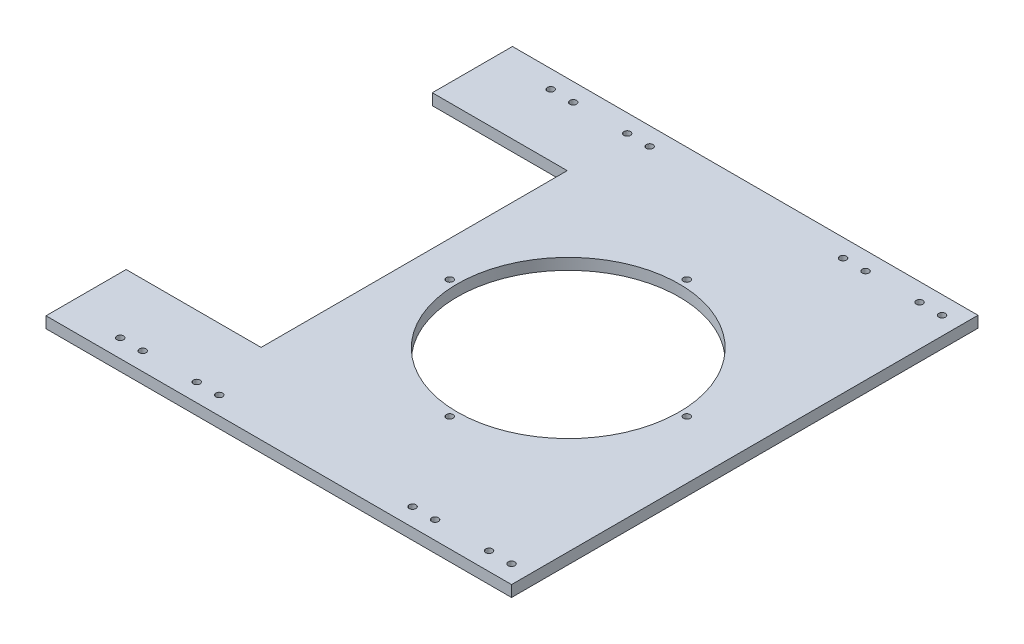
ISO-10303-21;
HEADER;
FILE_DESCRIPTION(('STEP AP214'),'2;1');
FILE_NAME('part.step','',(''),(''),'','','');
FILE_SCHEMA(('AUTOMOTIVE_DESIGN { 1 0 10303 214 1 1 1 1 }'));
ENDSEC;
DATA;
#1=APPLICATION_CONTEXT('core data for automotive mechanical design processes');
#2=APPLICATION_PROTOCOL_DEFINITION('international standard','automotive_design',2000,#1);
#3=PRODUCT_CONTEXT('',#1,'mechanical');
#4=PRODUCT('Part','Part','',(#3));
#5=PRODUCT_RELATED_PRODUCT_CATEGORY('part','',(#4));
#6=PRODUCT_DEFINITION_FORMATION('','',#4);
#7=PRODUCT_DEFINITION_CONTEXT('part definition',#1,'design');
#8=PRODUCT_DEFINITION('design','',#6,#7);
#9=PRODUCT_DEFINITION_SHAPE('','',#8);
#10=(LENGTH_UNIT() NAMED_UNIT(*) SI_UNIT(.MILLI.,.METRE.));
#11=(NAMED_UNIT(*) PLANE_ANGLE_UNIT() SI_UNIT($,.RADIAN.));
#12=(NAMED_UNIT(*) SI_UNIT($,.STERADIAN.) SOLID_ANGLE_UNIT());
#13=UNCERTAINTY_MEASURE_WITH_UNIT(LENGTH_MEASURE(1.E-05),#10,'distance_accuracy_value','');
#14=(GEOMETRIC_REPRESENTATION_CONTEXT(3) GLOBAL_UNCERTAINTY_ASSIGNED_CONTEXT((#13)) GLOBAL_UNIT_ASSIGNED_CONTEXT((#10,
#11,#12)) REPRESENTATION_CONTEXT('',''));
#15=CARTESIAN_POINT('',(0.,0.,0.));
#16=DIRECTION('',(0.,0.,1.));
#17=DIRECTION('',(1.,0.,0.));
#18=AXIS2_PLACEMENT_3D('',#15,#16,#17);
#19=CARTESIAN_POINT('',(-131.445,6.35,131.70027));
#20=DIRECTION('',(1.,0.,0.));
#21=DIRECTION('',(0.,0.,-1.));
#22=AXIS2_PLACEMENT_3D('',#19,#20,#21);
#23=PLANE('',#22);
#24=DIRECTION('',(0.,0.,1.));
#25=VECTOR('',#24,1.);
#26=CARTESIAN_POINT('',(-131.445,0.,131.70027));
#27=LINE('',#26,#25);
#28=CARTESIAN_POINT('',(-131.445,0.,-131.70027));
#29=VERTEX_POINT('',#28);
#30=CARTESIAN_POINT('',(-131.445,0.,-86.4439759484741));
#31=VERTEX_POINT('',#30);
#32=EDGE_CURVE('E137',#29,#31,#27,.T.);
#33=ORIENTED_EDGE('',*,*,#32,.T.);
#34=DIRECTION('',(0.,1.,0.));
#35=VECTOR('',#34,1.);
#36=CARTESIAN_POINT('',(-131.445,6.35,-86.4439759484741));
#37=LINE('',#36,#35);
#38=CARTESIAN_POINT('',(-131.445,6.35,-86.4439759484741));
#39=VERTEX_POINT('',#38);
#40=EDGE_CURVE('E41',#31,#39,#37,.T.);
#41=ORIENTED_EDGE('',*,*,#40,.T.);
#42=DIRECTION('',(0.,0.,1.));
#43=VECTOR('',#42,1.);
#44=CARTESIAN_POINT('',(-131.445,6.35,131.70027));
#45=LINE('',#44,#43);
#46=CARTESIAN_POINT('',(-131.445,6.35,-131.70027));
#47=VERTEX_POINT('',#46);
#48=EDGE_CURVE('E123',#47,#39,#45,.T.);
#49=ORIENTED_EDGE('',*,*,#48,.F.);
#50=DIRECTION('',(0.,-1.,0.));
#51=VECTOR('',#50,1.);
#52=CARTESIAN_POINT('',(-131.445,6.35,-131.70027));
#53=LINE('',#52,#51);
#54=EDGE_CURVE('E136',#47,#29,#53,.T.);
#55=ORIENTED_EDGE('',*,*,#54,.T.);
#56=EDGE_LOOP('',(#33,#41,#49,#55));
#57=FACE_BOUND('',#56,.T.);
#58=ADVANCED_FACE('F33',(#57),#23,.F.);
#59=CARTESIAN_POINT('',(0.,6.35,0.));
#60=DIRECTION('',(0.,1.,0.));
#61=DIRECTION('',(0.,0.,1.));
#62=AXIS2_PLACEMENT_3D('',#59,#60,#61);
#63=PLANE('',#62);
#64=DIRECTION('',(-1.,0.,0.));
#65=VECTOR('',#64,1.);
#66=CARTESIAN_POINT('',(-55.245,6.35,-86.4439759484741));
#67=LINE('',#66,#65);
#68=CARTESIAN_POINT('',(-55.245,6.35,-86.4439759484741));
#69=VERTEX_POINT('',#68);
#70=EDGE_CURVE('E156',#69,#39,#67,.T.);
#71=ORIENTED_EDGE('',*,*,#70,.F.);
#72=DIRECTION('',(0.,0.,-1.));
#73=VECTOR('',#72,1.);
#74=CARTESIAN_POINT('',(-55.245,6.35,86.4439759484741));
#75=LINE('',#74,#73);
#76=CARTESIAN_POINT('',(-55.245,6.35,86.4439759484741));
#77=VERTEX_POINT('',#76);
#78=EDGE_CURVE('E119',#77,#69,#75,.T.);
#79=ORIENTED_EDGE('',*,*,#78,.F.);
#80=DIRECTION('',(1.,0.,0.));
#81=VECTOR('',#80,1.);
#82=CARTESIAN_POINT('',(-55.245,6.35,86.4439759484741));
#83=LINE('',#82,#81);
#84=CARTESIAN_POINT('',(-131.445,6.35,86.4439759484741));
#85=VERTEX_POINT('',#84);
#86=EDGE_CURVE('E109',#85,#77,#83,.T.);
#87=ORIENTED_EDGE('',*,*,#86,.F.);
#88=CARTESIAN_POINT('',(-131.445,6.35,131.70027));
#89=VERTEX_POINT('',#88);
#90=EDGE_CURVE('E85',#85,#89,#45,.T.);
#91=ORIENTED_EDGE('',*,*,#90,.T.);
#92=DIRECTION('',(1.,0.,0.));
#93=VECTOR('',#92,1.);
#94=CARTESIAN_POINT('',(131.445,6.35,131.70027));
#95=LINE('',#94,#93);
#96=CARTESIAN_POINT('',(131.445,6.35,131.70027));
#97=VERTEX_POINT('',#96);
#98=EDGE_CURVE('E125',#89,#97,#95,.T.);
#99=ORIENTED_EDGE('',*,*,#98,.T.);
#100=DIRECTION('',(0.,0.,-1.));
#101=VECTOR('',#100,1.);
#102=CARTESIAN_POINT('',(131.445,6.35,131.70027));
#103=LINE('',#102,#101);
#104=CARTESIAN_POINT('',(131.445,6.35,-131.70027));
#105=VERTEX_POINT('',#104);
#106=EDGE_CURVE('E133',#97,#105,#103,.T.);
#107=ORIENTED_EDGE('',*,*,#106,.T.);
#108=DIRECTION('',(-1.,0.,0.));
#109=VECTOR('',#108,1.);
#110=CARTESIAN_POINT('',(131.445,6.35,-131.70027));
#111=LINE('',#110,#109);
#112=EDGE_CURVE('E57',#105,#47,#111,.T.);
#113=ORIENTED_EDGE('',*,*,#112,.T.);
#114=ORIENTED_EDGE('',*,*,#48,.T.);
#115=EDGE_LOOP('',(#71,#79,#87,#91,#99,#107,#113,#114));
#116=FACE_BOUND('',#115,.T.);
#117=CARTESIAN_POINT('',(-43.815,6.35,-121.54027));
#118=DIRECTION('',(0.,1.,0.));
#119=DIRECTION('',(0.,0.,1.));
#120=AXIS2_PLACEMENT_3D('',#117,#118,#119);
#121=CIRCLE('',#120,1.89864999999999);
#122=CARTESIAN_POINT('',(-43.815,6.35,-119.64162));
#123=VERTEX_POINT('',#122);
#124=EDGE_CURVE('E167',#123,#123,#121,.T.);
#125=ORIENTED_EDGE('',*,*,#124,.F.);
#126=EDGE_LOOP('',(#125));
#127=FACE_BOUND('',#126,.T.);
#128=CARTESIAN_POINT('',(-56.515,6.35,-121.54027));
#129=DIRECTION('',(0.,1.,0.));
#130=DIRECTION('',(0.,0.,1.));
#131=AXIS2_PLACEMENT_3D('',#128,#129,#130);
#132=CIRCLE('',#131,1.89864999999999);
#133=CARTESIAN_POINT('',(-56.515,6.35,-119.64162));
#134=VERTEX_POINT('',#133);
#135=EDGE_CURVE('E173',#134,#134,#132,.T.);
#136=ORIENTED_EDGE('',*,*,#135,.F.);
#137=EDGE_LOOP('',(#136));
#138=FACE_BOUND('',#137,.T.);
#139=CARTESIAN_POINT('',(-86.995,6.35,-121.54027));
#140=DIRECTION('',(0.,1.,0.));
#141=DIRECTION('',(0.,0.,1.));
#142=AXIS2_PLACEMENT_3D('',#139,#140,#141);
#143=CIRCLE('',#142,1.89864999999999);
#144=CARTESIAN_POINT('',(-86.995,6.35,-119.64162));
#145=VERTEX_POINT('',#144);
#146=EDGE_CURVE('E179',#145,#145,#143,.T.);
#147=ORIENTED_EDGE('',*,*,#146,.F.);
#148=EDGE_LOOP('',(#147));
#149=FACE_BOUND('',#148,.T.);
#150=CARTESIAN_POINT('',(-99.695,6.35,-121.54027));
#151=DIRECTION('',(0.,1.,0.));
#152=DIRECTION('',(0.,0.,1.));
#153=AXIS2_PLACEMENT_3D('',#150,#151,#152);
#154=CIRCLE('',#153,1.89864999999999);
#155=CARTESIAN_POINT('',(-99.695,6.35,-119.64162));
#156=VERTEX_POINT('',#155);
#157=EDGE_CURVE('E185',#156,#156,#154,.T.);
#158=ORIENTED_EDGE('',*,*,#157,.F.);
#159=EDGE_LOOP('',(#158));
#160=FACE_BOUND('',#159,.T.);
#161=CARTESIAN_POINT('',(-43.815,6.35,121.54027));
#162=DIRECTION('',(0.,1.,0.));
#163=DIRECTION('',(0.,0.,1.));
#164=AXIS2_PLACEMENT_3D('',#161,#162,#163);
#165=CIRCLE('',#164,1.89864999999999);
#166=CARTESIAN_POINT('',(-43.815,6.35,123.43892));
#167=VERTEX_POINT('',#166);
#168=EDGE_CURVE('E191',#167,#167,#165,.T.);
#169=ORIENTED_EDGE('',*,*,#168,.F.);
#170=EDGE_LOOP('',(#169));
#171=FACE_BOUND('',#170,.T.);
#172=CARTESIAN_POINT('',(-56.515,6.35,121.54027));
#173=DIRECTION('',(0.,1.,0.));
#174=DIRECTION('',(0.,0.,1.));
#175=AXIS2_PLACEMENT_3D('',#172,#173,#174);
#176=CIRCLE('',#175,1.89864999999999);
#177=CARTESIAN_POINT('',(-56.515,6.35,123.43892));
#178=VERTEX_POINT('',#177);
#179=EDGE_CURVE('E197',#178,#178,#176,.T.);
#180=ORIENTED_EDGE('',*,*,#179,.F.);
#181=EDGE_LOOP('',(#180));
#182=FACE_BOUND('',#181,.T.);
#183=CARTESIAN_POINT('',(-86.995,6.35,121.54027));
#184=DIRECTION('',(0.,1.,0.));
#185=DIRECTION('',(0.,0.,1.));
#186=AXIS2_PLACEMENT_3D('',#183,#184,#185);
#187=CIRCLE('',#186,1.89864999999999);
#188=CARTESIAN_POINT('',(-86.995,6.35,123.43892));
#189=VERTEX_POINT('',#188);
#190=EDGE_CURVE('E203',#189,#189,#187,.T.);
#191=ORIENTED_EDGE('',*,*,#190,.F.);
#192=EDGE_LOOP('',(#191));
#193=FACE_BOUND('',#192,.T.);
#194=CARTESIAN_POINT('',(-99.695,6.35,121.54027));
#195=DIRECTION('',(0.,1.,0.));
#196=DIRECTION('',(0.,0.,1.));
#197=AXIS2_PLACEMENT_3D('',#194,#195,#196);
#198=CIRCLE('',#197,1.89864999999999);
#199=CARTESIAN_POINT('',(-99.695,6.35,123.43892));
#200=VERTEX_POINT('',#199);
#201=EDGE_CURVE('E209',#200,#200,#198,.T.);
#202=ORIENTED_EDGE('',*,*,#201,.F.);
#203=EDGE_LOOP('',(#202));
#204=FACE_BOUND('',#203,.T.);
#205=CARTESIAN_POINT('',(121.285,6.35,-121.54027));
#206=DIRECTION('',(0.,1.,0.));
#207=DIRECTION('',(0.,0.,1.));
#208=AXIS2_PLACEMENT_3D('',#205,#206,#207);
#209=CIRCLE('',#208,1.89864999999999);
#210=CARTESIAN_POINT('',(121.285,6.35,-119.64162));
#211=VERTEX_POINT('',#210);
#212=EDGE_CURVE('E215',#211,#211,#209,.T.);
#213=ORIENTED_EDGE('',*,*,#212,.F.);
#214=EDGE_LOOP('',(#213));
#215=FACE_BOUND('',#214,.T.);
#216=CARTESIAN_POINT('',(108.585,6.35,-121.54027));
#217=DIRECTION('',(0.,1.,0.));
#218=DIRECTION('',(0.,0.,1.));
#219=AXIS2_PLACEMENT_3D('',#216,#217,#218);
#220=CIRCLE('',#219,1.89864999999999);
#221=CARTESIAN_POINT('',(108.585,6.35,-119.64162));
#222=VERTEX_POINT('',#221);
#223=EDGE_CURVE('E221',#222,#222,#220,.T.);
#224=ORIENTED_EDGE('',*,*,#223,.F.);
#225=EDGE_LOOP('',(#224));
#226=FACE_BOUND('',#225,.T.);
#227=CARTESIAN_POINT('',(78.105,6.35,-121.54027));
#228=DIRECTION('',(0.,1.,0.));
#229=DIRECTION('',(0.,0.,1.));
#230=AXIS2_PLACEMENT_3D('',#227,#228,#229);
#231=CIRCLE('',#230,1.89864999999999);
#232=CARTESIAN_POINT('',(78.105,6.35,-119.64162));
#233=VERTEX_POINT('',#232);
#234=EDGE_CURVE('E227',#233,#233,#231,.T.);
#235=ORIENTED_EDGE('',*,*,#234,.F.);
#236=EDGE_LOOP('',(#235));
#237=FACE_BOUND('',#236,.T.);
#238=CARTESIAN_POINT('',(65.405,6.35,-121.54027));
#239=DIRECTION('',(0.,1.,0.));
#240=DIRECTION('',(0.,0.,1.));
#241=AXIS2_PLACEMENT_3D('',#238,#239,#240);
#242=CIRCLE('',#241,1.89864999999999);
#243=CARTESIAN_POINT('',(65.405,6.35,-119.64162));
#244=VERTEX_POINT('',#243);
#245=EDGE_CURVE('E233',#244,#244,#242,.T.);
#246=ORIENTED_EDGE('',*,*,#245,.F.);
#247=EDGE_LOOP('',(#246));
#248=FACE_BOUND('',#247,.T.);
#249=CARTESIAN_POINT('',(121.285,6.35,121.54027));
#250=DIRECTION('',(0.,1.,0.));
#251=DIRECTION('',(0.,0.,1.));
#252=AXIS2_PLACEMENT_3D('',#249,#250,#251);
#253=CIRCLE('',#252,1.89864999999999);
#254=CARTESIAN_POINT('',(121.285,6.35,123.43892));
#255=VERTEX_POINT('',#254);
#256=EDGE_CURVE('E239',#255,#255,#253,.T.);
#257=ORIENTED_EDGE('',*,*,#256,.F.);
#258=EDGE_LOOP('',(#257));
#259=FACE_BOUND('',#258,.T.);
#260=CARTESIAN_POINT('',(108.585,6.35,121.54027));
#261=DIRECTION('',(0.,1.,0.));
#262=DIRECTION('',(0.,0.,1.));
#263=AXIS2_PLACEMENT_3D('',#260,#261,#262);
#264=CIRCLE('',#263,1.89864999999999);
#265=CARTESIAN_POINT('',(108.585,6.35,123.43892));
#266=VERTEX_POINT('',#265);
#267=EDGE_CURVE('E245',#266,#266,#264,.T.);
#268=ORIENTED_EDGE('',*,*,#267,.F.);
#269=EDGE_LOOP('',(#268));
#270=FACE_BOUND('',#269,.T.);
#271=CARTESIAN_POINT('',(78.105,6.35,121.54027));
#272=DIRECTION('',(0.,1.,0.));
#273=DIRECTION('',(0.,0.,1.));
#274=AXIS2_PLACEMENT_3D('',#271,#272,#273);
#275=CIRCLE('',#274,1.89864999999999);
#276=CARTESIAN_POINT('',(78.105,6.35,123.43892));
#277=VERTEX_POINT('',#276);
#278=EDGE_CURVE('E251',#277,#277,#275,.T.);
#279=ORIENTED_EDGE('',*,*,#278,.F.);
#280=EDGE_LOOP('',(#279));
#281=FACE_BOUND('',#280,.T.);
#282=CARTESIAN_POINT('',(65.405,6.35,121.54027));
#283=DIRECTION('',(0.,1.,0.));
#284=DIRECTION('',(0.,0.,1.));
#285=AXIS2_PLACEMENT_3D('',#282,#283,#284);
#286=CIRCLE('',#285,1.89864999999999);
#287=CARTESIAN_POINT('',(65.405,6.35,123.43892));
#288=VERTEX_POINT('',#287);
#289=EDGE_CURVE('E257',#288,#288,#286,.T.);
#290=ORIENTED_EDGE('',*,*,#289,.F.);
#291=EDGE_LOOP('',(#290));
#292=FACE_BOUND('',#291,.T.);
#293=CARTESIAN_POINT('',(31.75,6.35,-66.94678));
#294=DIRECTION('',(0.,1.,0.));
#295=DIRECTION('',(0.,0.,1.));
#296=AXIS2_PLACEMENT_3D('',#293,#294,#295);
#297=CIRCLE('',#296,1.89865);
#298=CARTESIAN_POINT('',(31.75,6.35,-65.04813));
#299=VERTEX_POINT('',#298);
#300=EDGE_CURVE('E263',#299,#299,#297,.T.);
#301=ORIENTED_EDGE('',*,*,#300,.F.);
#302=EDGE_LOOP('',(#301));
#303=FACE_BOUND('',#302,.T.);
#304=CARTESIAN_POINT('',(-35.19678,6.35,0.));
#305=DIRECTION('',(0.,1.,0.));
#306=DIRECTION('',(0.,0.,1.));
#307=AXIS2_PLACEMENT_3D('',#304,#305,#306);
#308=CIRCLE('',#307,1.89865);
#309=CARTESIAN_POINT('',(-35.19678,6.35,1.89865));
#310=VERTEX_POINT('',#309);
#311=EDGE_CURVE('E269',#310,#310,#308,.T.);
#312=ORIENTED_EDGE('',*,*,#311,.F.);
#313=EDGE_LOOP('',(#312));
#314=FACE_BOUND('',#313,.T.);
#315=CARTESIAN_POINT('',(98.69678,6.35,0.));
#316=DIRECTION('',(0.,1.,0.));
#317=DIRECTION('',(0.,0.,1.));
#318=AXIS2_PLACEMENT_3D('',#315,#316,#317);
#319=CIRCLE('',#318,1.89865);
#320=CARTESIAN_POINT('',(98.69678,6.35,1.89865));
#321=VERTEX_POINT('',#320);
#322=EDGE_CURVE('E275',#321,#321,#319,.T.);
#323=ORIENTED_EDGE('',*,*,#322,.F.);
#324=EDGE_LOOP('',(#323));
#325=FACE_BOUND('',#324,.T.);
#326=CARTESIAN_POINT('',(31.75,6.35,66.94678));
#327=DIRECTION('',(0.,1.,0.));
#328=DIRECTION('',(0.,0.,1.));
#329=AXIS2_PLACEMENT_3D('',#326,#327,#328);
#330=CIRCLE('',#329,1.89865);
#331=CARTESIAN_POINT('',(31.75,6.35,68.84543));
#332=VERTEX_POINT('',#331);
#333=EDGE_CURVE('E281',#332,#332,#330,.T.);
#334=ORIENTED_EDGE('',*,*,#333,.F.);
#335=EDGE_LOOP('',(#334));
#336=FACE_BOUND('',#335,.T.);
#337=CARTESIAN_POINT('',(31.75,6.35,0.));
#338=DIRECTION('',(0.,1.,0.));
#339=DIRECTION('',(0.,0.,1.));
#340=AXIS2_PLACEMENT_3D('',#337,#338,#339);
#341=CIRCLE('',#340,62.6745);
#342=CARTESIAN_POINT('',(31.75,6.35,62.6745));
#343=VERTEX_POINT('',#342);
#344=EDGE_CURVE('E286',#343,#343,#341,.T.);
#345=ORIENTED_EDGE('',*,*,#344,.F.);
#346=EDGE_LOOP('',(#345));
#347=FACE_BOUND('',#346,.T.);
#348=ADVANCED_FACE('F116',(#116,#127,#138,#149,#160,#171,#182,#193,#204,#215,#226,#237,#248,
#259,#270,#281,#292,#303,#314,#325,#336,#347),#63,.T.);
#349=CARTESIAN_POINT('',(0.,0.,0.));
#350=DIRECTION('',(0.,1.,0.));
#351=DIRECTION('',(0.,0.,1.));
#352=AXIS2_PLACEMENT_3D('',#349,#350,#351);
#353=PLANE('',#352);
#354=CARTESIAN_POINT('',(-43.815,0.,-121.54027));
#355=DIRECTION('',(0.,1.,0.));
#356=DIRECTION('',(0.,0.,1.));
#357=AXIS2_PLACEMENT_3D('',#354,#355,#356);
#358=CIRCLE('',#357,1.89864999999999);
#359=CARTESIAN_POINT('',(-43.815,0.,-119.64162));
#360=VERTEX_POINT('',#359);
#361=EDGE_CURVE('E170',#360,#360,#358,.T.);
#362=ORIENTED_EDGE('',*,*,#361,.T.);
#363=EDGE_LOOP('',(#362));
#364=FACE_BOUND('',#363,.T.);
#365=CARTESIAN_POINT('',(-56.515,0.,-121.54027));
#366=DIRECTION('',(0.,1.,0.));
#367=DIRECTION('',(0.,0.,1.));
#368=AXIS2_PLACEMENT_3D('',#365,#366,#367);
#369=CIRCLE('',#368,1.89864999999999);
#370=CARTESIAN_POINT('',(-56.515,0.,-119.64162));
#371=VERTEX_POINT('',#370);
#372=EDGE_CURVE('E176',#371,#371,#369,.T.);
#373=ORIENTED_EDGE('',*,*,#372,.T.);
#374=EDGE_LOOP('',(#373));
#375=FACE_BOUND('',#374,.T.);
#376=CARTESIAN_POINT('',(-86.995,0.,-121.54027));
#377=DIRECTION('',(0.,1.,0.));
#378=DIRECTION('',(0.,0.,1.));
#379=AXIS2_PLACEMENT_3D('',#376,#377,#378);
#380=CIRCLE('',#379,1.89864999999999);
#381=CARTESIAN_POINT('',(-86.995,0.,-119.64162));
#382=VERTEX_POINT('',#381);
#383=EDGE_CURVE('E182',#382,#382,#380,.T.);
#384=ORIENTED_EDGE('',*,*,#383,.T.);
#385=EDGE_LOOP('',(#384));
#386=FACE_BOUND('',#385,.T.);
#387=CARTESIAN_POINT('',(-99.695,0.,-121.54027));
#388=DIRECTION('',(0.,1.,0.));
#389=DIRECTION('',(0.,0.,1.));
#390=AXIS2_PLACEMENT_3D('',#387,#388,#389);
#391=CIRCLE('',#390,1.89864999999999);
#392=CARTESIAN_POINT('',(-99.695,0.,-119.64162));
#393=VERTEX_POINT('',#392);
#394=EDGE_CURVE('E188',#393,#393,#391,.T.);
#395=ORIENTED_EDGE('',*,*,#394,.T.);
#396=EDGE_LOOP('',(#395));
#397=FACE_BOUND('',#396,.T.);
#398=CARTESIAN_POINT('',(-43.815,0.,121.54027));
#399=DIRECTION('',(0.,1.,0.));
#400=DIRECTION('',(0.,0.,1.));
#401=AXIS2_PLACEMENT_3D('',#398,#399,#400);
#402=CIRCLE('',#401,1.89864999999999);
#403=CARTESIAN_POINT('',(-43.815,0.,123.43892));
#404=VERTEX_POINT('',#403);
#405=EDGE_CURVE('E194',#404,#404,#402,.T.);
#406=ORIENTED_EDGE('',*,*,#405,.T.);
#407=EDGE_LOOP('',(#406));
#408=FACE_BOUND('',#407,.T.);
#409=CARTESIAN_POINT('',(-56.515,0.,121.54027));
#410=DIRECTION('',(0.,1.,0.));
#411=DIRECTION('',(0.,0.,1.));
#412=AXIS2_PLACEMENT_3D('',#409,#410,#411);
#413=CIRCLE('',#412,1.89864999999999);
#414=CARTESIAN_POINT('',(-56.515,0.,123.43892));
#415=VERTEX_POINT('',#414);
#416=EDGE_CURVE('E200',#415,#415,#413,.T.);
#417=ORIENTED_EDGE('',*,*,#416,.T.);
#418=EDGE_LOOP('',(#417));
#419=FACE_BOUND('',#418,.T.);
#420=CARTESIAN_POINT('',(-86.995,0.,121.54027));
#421=DIRECTION('',(0.,1.,0.));
#422=DIRECTION('',(0.,0.,1.));
#423=AXIS2_PLACEMENT_3D('',#420,#421,#422);
#424=CIRCLE('',#423,1.89864999999999);
#425=CARTESIAN_POINT('',(-86.995,0.,123.43892));
#426=VERTEX_POINT('',#425);
#427=EDGE_CURVE('E206',#426,#426,#424,.T.);
#428=ORIENTED_EDGE('',*,*,#427,.T.);
#429=EDGE_LOOP('',(#428));
#430=FACE_BOUND('',#429,.T.);
#431=CARTESIAN_POINT('',(-99.695,0.,121.54027));
#432=DIRECTION('',(0.,1.,0.));
#433=DIRECTION('',(0.,0.,1.));
#434=AXIS2_PLACEMENT_3D('',#431,#432,#433);
#435=CIRCLE('',#434,1.89864999999999);
#436=CARTESIAN_POINT('',(-99.695,0.,123.43892));
#437=VERTEX_POINT('',#436);
#438=EDGE_CURVE('E212',#437,#437,#435,.T.);
#439=ORIENTED_EDGE('',*,*,#438,.T.);
#440=EDGE_LOOP('',(#439));
#441=FACE_BOUND('',#440,.T.);
#442=CARTESIAN_POINT('',(121.285,0.,-121.54027));
#443=DIRECTION('',(0.,1.,0.));
#444=DIRECTION('',(0.,0.,1.));
#445=AXIS2_PLACEMENT_3D('',#442,#443,#444);
#446=CIRCLE('',#445,1.89865);
#447=CARTESIAN_POINT('',(121.285,0.,-119.64162));
#448=VERTEX_POINT('',#447);
#449=EDGE_CURVE('E218',#448,#448,#446,.T.);
#450=ORIENTED_EDGE('',*,*,#449,.T.);
#451=EDGE_LOOP('',(#450));
#452=FACE_BOUND('',#451,.T.);
#453=CARTESIAN_POINT('',(108.585,0.,-121.54027));
#454=DIRECTION('',(0.,1.,0.));
#455=DIRECTION('',(0.,0.,1.));
#456=AXIS2_PLACEMENT_3D('',#453,#454,#455);
#457=CIRCLE('',#456,1.89865);
#458=CARTESIAN_POINT('',(108.585,0.,-119.64162));
#459=VERTEX_POINT('',#458);
#460=EDGE_CURVE('E224',#459,#459,#457,.T.);
#461=ORIENTED_EDGE('',*,*,#460,.T.);
#462=EDGE_LOOP('',(#461));
#463=FACE_BOUND('',#462,.T.);
#464=CARTESIAN_POINT('',(78.105,0.,-121.54027));
#465=DIRECTION('',(0.,1.,0.));
#466=DIRECTION('',(0.,0.,1.));
#467=AXIS2_PLACEMENT_3D('',#464,#465,#466);
#468=CIRCLE('',#467,1.89865);
#469=CARTESIAN_POINT('',(78.105,0.,-119.64162));
#470=VERTEX_POINT('',#469);
#471=EDGE_CURVE('E230',#470,#470,#468,.T.);
#472=ORIENTED_EDGE('',*,*,#471,.T.);
#473=EDGE_LOOP('',(#472));
#474=FACE_BOUND('',#473,.T.);
#475=CARTESIAN_POINT('',(65.405,0.,-121.54027));
#476=DIRECTION('',(0.,1.,0.));
#477=DIRECTION('',(0.,0.,1.));
#478=AXIS2_PLACEMENT_3D('',#475,#476,#477);
#479=CIRCLE('',#478,1.89865);
#480=CARTESIAN_POINT('',(65.405,0.,-119.64162));
#481=VERTEX_POINT('',#480);
#482=EDGE_CURVE('E236',#481,#481,#479,.T.);
#483=ORIENTED_EDGE('',*,*,#482,.T.);
#484=EDGE_LOOP('',(#483));
#485=FACE_BOUND('',#484,.T.);
#486=CARTESIAN_POINT('',(121.285,0.,121.54027));
#487=DIRECTION('',(0.,1.,0.));
#488=DIRECTION('',(0.,0.,1.));
#489=AXIS2_PLACEMENT_3D('',#486,#487,#488);
#490=CIRCLE('',#489,1.89865);
#491=CARTESIAN_POINT('',(121.285,0.,123.43892));
#492=VERTEX_POINT('',#491);
#493=EDGE_CURVE('E242',#492,#492,#490,.T.);
#494=ORIENTED_EDGE('',*,*,#493,.T.);
#495=EDGE_LOOP('',(#494));
#496=FACE_BOUND('',#495,.T.);
#497=CARTESIAN_POINT('',(108.585,0.,121.54027));
#498=DIRECTION('',(0.,1.,0.));
#499=DIRECTION('',(0.,0.,1.));
#500=AXIS2_PLACEMENT_3D('',#497,#498,#499);
#501=CIRCLE('',#500,1.89865);
#502=CARTESIAN_POINT('',(108.585,0.,123.43892));
#503=VERTEX_POINT('',#502);
#504=EDGE_CURVE('E248',#503,#503,#501,.T.);
#505=ORIENTED_EDGE('',*,*,#504,.T.);
#506=EDGE_LOOP('',(#505));
#507=FACE_BOUND('',#506,.T.);
#508=CARTESIAN_POINT('',(78.105,0.,121.54027));
#509=DIRECTION('',(0.,1.,0.));
#510=DIRECTION('',(0.,0.,1.));
#511=AXIS2_PLACEMENT_3D('',#508,#509,#510);
#512=CIRCLE('',#511,1.89865);
#513=CARTESIAN_POINT('',(78.105,0.,123.43892));
#514=VERTEX_POINT('',#513);
#515=EDGE_CURVE('E254',#514,#514,#512,.T.);
#516=ORIENTED_EDGE('',*,*,#515,.T.);
#517=EDGE_LOOP('',(#516));
#518=FACE_BOUND('',#517,.T.);
#519=CARTESIAN_POINT('',(65.405,0.,121.54027));
#520=DIRECTION('',(0.,1.,0.));
#521=DIRECTION('',(0.,0.,1.));
#522=AXIS2_PLACEMENT_3D('',#519,#520,#521);
#523=CIRCLE('',#522,1.89865);
#524=CARTESIAN_POINT('',(65.405,0.,123.43892));
#525=VERTEX_POINT('',#524);
#526=EDGE_CURVE('E260',#525,#525,#523,.T.);
#527=ORIENTED_EDGE('',*,*,#526,.T.);
#528=EDGE_LOOP('',(#527));
#529=FACE_BOUND('',#528,.T.);
#530=CARTESIAN_POINT('',(31.75,0.,-66.94678));
#531=DIRECTION('',(0.,1.,0.));
#532=DIRECTION('',(0.,0.,1.));
#533=AXIS2_PLACEMENT_3D('',#530,#531,#532);
#534=CIRCLE('',#533,1.89865);
#535=CARTESIAN_POINT('',(31.75,0.,-65.04813));
#536=VERTEX_POINT('',#535);
#537=EDGE_CURVE('E266',#536,#536,#534,.T.);
#538=ORIENTED_EDGE('',*,*,#537,.T.);
#539=EDGE_LOOP('',(#538));
#540=FACE_BOUND('',#539,.T.);
#541=CARTESIAN_POINT('',(-35.19678,0.,0.));
#542=DIRECTION('',(0.,1.,0.));
#543=DIRECTION('',(0.,0.,1.));
#544=AXIS2_PLACEMENT_3D('',#541,#542,#543);
#545=CIRCLE('',#544,1.89865);
#546=CARTESIAN_POINT('',(-35.19678,0.,1.89865));
#547=VERTEX_POINT('',#546);
#548=EDGE_CURVE('E272',#547,#547,#545,.T.);
#549=ORIENTED_EDGE('',*,*,#548,.T.);
#550=EDGE_LOOP('',(#549));
#551=FACE_BOUND('',#550,.T.);
#552=CARTESIAN_POINT('',(98.69678,0.,0.));
#553=DIRECTION('',(0.,1.,0.));
#554=DIRECTION('',(0.,0.,1.));
#555=AXIS2_PLACEMENT_3D('',#552,#553,#554);
#556=CIRCLE('',#555,1.89865);
#557=CARTESIAN_POINT('',(98.69678,0.,1.89865));
#558=VERTEX_POINT('',#557);
#559=EDGE_CURVE('E278',#558,#558,#556,.T.);
#560=ORIENTED_EDGE('',*,*,#559,.T.);
#561=EDGE_LOOP('',(#560));
#562=FACE_BOUND('',#561,.T.);
#563=CARTESIAN_POINT('',(31.75,0.,66.94678));
#564=DIRECTION('',(0.,1.,0.));
#565=DIRECTION('',(0.,0.,1.));
#566=AXIS2_PLACEMENT_3D('',#563,#564,#565);
#567=CIRCLE('',#566,1.89865);
#568=CARTESIAN_POINT('',(31.75,0.,68.84543));
#569=VERTEX_POINT('',#568);
#570=EDGE_CURVE('E284',#569,#569,#567,.T.);
#571=ORIENTED_EDGE('',*,*,#570,.T.);
#572=EDGE_LOOP('',(#571));
#573=FACE_BOUND('',#572,.T.);
#574=DIRECTION('',(0.,0.,-1.));
#575=VECTOR('',#574,1.);
#576=CARTESIAN_POINT('',(-55.245,0.,0.));
#577=LINE('',#576,#575);
#578=CARTESIAN_POINT('',(-55.245,0.,86.4439759484741));
#579=VERTEX_POINT('',#578);
#580=CARTESIAN_POINT('',(-55.245,0.,-86.4439759484741));
#581=VERTEX_POINT('',#580);
#582=EDGE_CURVE('E11',#579,#581,#577,.T.);
#583=ORIENTED_EDGE('',*,*,#582,.T.);
#584=DIRECTION('',(-1.,0.,0.));
#585=VECTOR('',#584,1.);
#586=CARTESIAN_POINT('',(0.,0.,-86.4439759484741));
#587=LINE('',#586,#585);
#588=EDGE_CURVE('E165',#581,#31,#587,.T.);
#589=ORIENTED_EDGE('',*,*,#588,.T.);
#590=ORIENTED_EDGE('',*,*,#32,.F.);
#591=DIRECTION('',(-1.,0.,0.));
#592=VECTOR('',#591,1.);
#593=CARTESIAN_POINT('',(131.445,0.,-131.70027));
#594=LINE('',#593,#592);
#595=CARTESIAN_POINT('',(131.445,0.,-131.70027));
#596=VERTEX_POINT('',#595);
#597=EDGE_CURVE('E78',#596,#29,#594,.T.);
#598=ORIENTED_EDGE('',*,*,#597,.F.);
#599=DIRECTION('',(0.,0.,-1.));
#600=VECTOR('',#599,1.);
#601=CARTESIAN_POINT('',(131.445,0.,131.70027));
#602=LINE('',#601,#600);
#603=CARTESIAN_POINT('',(131.445,0.,131.70027));
#604=VERTEX_POINT('',#603);
#605=EDGE_CURVE('E126',#604,#596,#602,.T.);
#606=ORIENTED_EDGE('',*,*,#605,.F.);
#607=DIRECTION('',(1.,0.,0.));
#608=VECTOR('',#607,1.);
#609=CARTESIAN_POINT('',(131.445,0.,131.70027));
#610=LINE('',#609,#608);
#611=CARTESIAN_POINT('',(-131.445,0.,131.70027));
#612=VERTEX_POINT('',#611);
#613=EDGE_CURVE('E140',#612,#604,#610,.T.);
#614=ORIENTED_EDGE('',*,*,#613,.F.);
#615=CARTESIAN_POINT('',(-131.445,0.,86.4439759484741));
#616=VERTEX_POINT('',#615);
#617=EDGE_CURVE('E141',#616,#612,#27,.T.);
#618=ORIENTED_EDGE('',*,*,#617,.F.);
#619=DIRECTION('',(1.,0.,0.));
#620=VECTOR('',#619,1.);
#621=CARTESIAN_POINT('',(0.,0.,86.4439759484741));
#622=LINE('',#621,#620);
#623=EDGE_CURVE('E48',#616,#579,#622,.T.);
#624=ORIENTED_EDGE('',*,*,#623,.T.);
#625=EDGE_LOOP('',(#583,#589,#590,#598,#606,#614,#618,#624));
#626=FACE_BOUND('',#625,.T.);
#627=CARTESIAN_POINT('',(31.75,0.,0.));
#628=DIRECTION('',(0.,1.,0.));
#629=DIRECTION('',(0.,0.,1.));
#630=AXIS2_PLACEMENT_3D('',#627,#628,#629);
#631=CIRCLE('',#630,62.6745);
#632=CARTESIAN_POINT('',(31.75,0.,62.6745));
#633=VERTEX_POINT('',#632);
#634=EDGE_CURVE('E130',#633,#633,#631,.T.);
#635=ORIENTED_EDGE('',*,*,#634,.T.);
#636=EDGE_LOOP('',(#635));
#637=FACE_BOUND('',#636,.T.);
#638=ADVANCED_FACE('F293',(#364,#375,#386,#397,#408,#419,#430,#441,#452,#463,#474,#485,#496,
#507,#518,#529,#540,#551,#562,#573,#626,#637),#353,.F.);
#639=ORIENTED_EDGE('',*,*,#90,.F.);
#640=DIRECTION('',(0.,-1.,0.));
#641=VECTOR('',#640,1.);
#642=CARTESIAN_POINT('',(-131.445,6.35,86.4439759484741));
#643=LINE('',#642,#641);
#644=EDGE_CURVE('E107',#85,#616,#643,.T.);
#645=ORIENTED_EDGE('',*,*,#644,.T.);
#646=ORIENTED_EDGE('',*,*,#617,.T.);
#647=DIRECTION('',(0.,-1.,0.));
#648=VECTOR('',#647,1.);
#649=CARTESIAN_POINT('',(-131.445,6.35,131.70027));
#650=LINE('',#649,#648);
#651=EDGE_CURVE('E113',#89,#612,#650,.T.);
#652=ORIENTED_EDGE('',*,*,#651,.F.);
#653=EDGE_LOOP('',(#639,#645,#646,#652));
#654=FACE_BOUND('',#653,.T.);
#655=ADVANCED_FACE('F35',(#654),#23,.F.);
#656=CARTESIAN_POINT('',(131.445,6.35,131.70027));
#657=DIRECTION('',(0.,0.,-1.));
#658=DIRECTION('',(-1.,0.,0.));
#659=AXIS2_PLACEMENT_3D('',#656,#657,#658);
#660=PLANE('',#659);
#661=ORIENTED_EDGE('',*,*,#613,.T.);
#662=DIRECTION('',(0.,-1.,0.));
#663=VECTOR('',#662,1.);
#664=CARTESIAN_POINT('',(131.445,6.35,131.70027));
#665=LINE('',#664,#663);
#666=EDGE_CURVE('E147',#97,#604,#665,.T.);
#667=ORIENTED_EDGE('',*,*,#666,.F.);
#668=ORIENTED_EDGE('',*,*,#98,.F.);
#669=ORIENTED_EDGE('',*,*,#651,.T.);
#670=EDGE_LOOP('',(#661,#667,#668,#669));
#671=FACE_BOUND('',#670,.T.);
#672=ADVANCED_FACE('F316',(#671),#660,.F.);
#673=CARTESIAN_POINT('',(131.445,6.35,131.70027));
#674=DIRECTION('',(-1.,0.,0.));
#675=DIRECTION('',(0.,0.,1.));
#676=AXIS2_PLACEMENT_3D('',#673,#674,#675);
#677=PLANE('',#676);
#678=ORIENTED_EDGE('',*,*,#605,.T.);
#679=DIRECTION('',(0.,-1.,0.));
#680=VECTOR('',#679,1.);
#681=CARTESIAN_POINT('',(131.445,6.35,-131.70027));
#682=LINE('',#681,#680);
#683=EDGE_CURVE('E145',#105,#596,#682,.T.);
#684=ORIENTED_EDGE('',*,*,#683,.F.);
#685=ORIENTED_EDGE('',*,*,#106,.F.);
#686=ORIENTED_EDGE('',*,*,#666,.T.);
#687=EDGE_LOOP('',(#678,#684,#685,#686));
#688=FACE_BOUND('',#687,.T.);
#689=ADVANCED_FACE('F307',(#688),#677,.F.);
#690=CARTESIAN_POINT('',(131.445,6.35,-131.70027));
#691=DIRECTION('',(0.,0.,1.));
#692=DIRECTION('',(1.,0.,0.));
#693=AXIS2_PLACEMENT_3D('',#690,#691,#692);
#694=PLANE('',#693);
#695=ORIENTED_EDGE('',*,*,#597,.T.);
#696=ORIENTED_EDGE('',*,*,#54,.F.);
#697=ORIENTED_EDGE('',*,*,#112,.F.);
#698=ORIENTED_EDGE('',*,*,#683,.T.);
#699=EDGE_LOOP('',(#695,#696,#697,#698));
#700=FACE_BOUND('',#699,.T.);
#701=ADVANCED_FACE('F298',(#700),#694,.F.);
#702=CARTESIAN_POINT('',(31.75,6.35,0.));
#703=DIRECTION('',(0.,-1.,0.));
#704=DIRECTION('',(0.,0.,-1.));
#705=AXIS2_PLACEMENT_3D('',#702,#703,#704);
#706=CYLINDRICAL_SURFACE('',#705,62.6745);
#707=ORIENTED_EDGE('',*,*,#344,.T.);
#708=EDGE_LOOP('',(#707));
#709=FACE_BOUND('',#708,.T.);
#710=ORIENTED_EDGE('',*,*,#634,.F.);
#711=EDGE_LOOP('',(#710));
#712=FACE_BOUND('',#711,.T.);
#713=ADVANCED_FACE('F295',(#709,#712),#706,.F.);
#714=CARTESIAN_POINT('',(31.75,6.35,66.94678));
#715=DIRECTION('',(0.,1.,0.));
#716=DIRECTION('',(0.,0.,1.));
#717=AXIS2_PLACEMENT_3D('',#714,#715,#716);
#718=CYLINDRICAL_SURFACE('',#717,1.89865);
#719=ORIENTED_EDGE('',*,*,#570,.F.);
#720=EDGE_LOOP('',(#719));
#721=FACE_BOUND('',#720,.T.);
#722=ORIENTED_EDGE('',*,*,#333,.T.);
#723=EDGE_LOOP('',(#722));
#724=FACE_BOUND('',#723,.T.);
#725=ADVANCED_FACE('F297',(#721,#724),#718,.F.);
#726=CARTESIAN_POINT('',(98.69678,6.35,0.));
#727=DIRECTION('',(0.,1.,0.));
#728=DIRECTION('',(0.,0.,1.));
#729=AXIS2_PLACEMENT_3D('',#726,#727,#728);
#730=CYLINDRICAL_SURFACE('',#729,1.89865);
#731=ORIENTED_EDGE('',*,*,#559,.F.);
#732=EDGE_LOOP('',(#731));
#733=FACE_BOUND('',#732,.T.);
#734=ORIENTED_EDGE('',*,*,#322,.T.);
#735=EDGE_LOOP('',(#734));
#736=FACE_BOUND('',#735,.T.);
#737=ADVANCED_FACE('F304',(#733,#736),#730,.F.);
#738=CARTESIAN_POINT('',(-35.19678,6.35,0.));
#739=DIRECTION('',(0.,1.,0.));
#740=DIRECTION('',(0.,0.,1.));
#741=AXIS2_PLACEMENT_3D('',#738,#739,#740);
#742=CYLINDRICAL_SURFACE('',#741,1.89865);
#743=ORIENTED_EDGE('',*,*,#548,.F.);
#744=EDGE_LOOP('',(#743));
#745=FACE_BOUND('',#744,.T.);
#746=ORIENTED_EDGE('',*,*,#311,.T.);
#747=EDGE_LOOP('',(#746));
#748=FACE_BOUND('',#747,.T.);
#749=ADVANCED_FACE('F419',(#745,#748),#742,.F.);
#750=CARTESIAN_POINT('',(31.75,6.35,-66.94678));
#751=DIRECTION('',(0.,1.,0.));
#752=DIRECTION('',(0.,0.,1.));
#753=AXIS2_PLACEMENT_3D('',#750,#751,#752);
#754=CYLINDRICAL_SURFACE('',#753,1.89865);
#755=ORIENTED_EDGE('',*,*,#537,.F.);
#756=EDGE_LOOP('',(#755));
#757=FACE_BOUND('',#756,.T.);
#758=ORIENTED_EDGE('',*,*,#300,.T.);
#759=EDGE_LOOP('',(#758));
#760=FACE_BOUND('',#759,.T.);
#761=ADVANCED_FACE('F415',(#757,#760),#754,.F.);
#762=CARTESIAN_POINT('',(65.405,6.35,121.54027));
#763=DIRECTION('',(0.,1.,0.));
#764=DIRECTION('',(0.,0.,1.));
#765=AXIS2_PLACEMENT_3D('',#762,#763,#764);
#766=CYLINDRICAL_SURFACE('',#765,1.89864999999999);
#767=ORIENTED_EDGE('',*,*,#526,.F.);
#768=EDGE_LOOP('',(#767));
#769=FACE_BOUND('',#768,.T.);
#770=ORIENTED_EDGE('',*,*,#289,.T.);
#771=EDGE_LOOP('',(#770));
#772=FACE_BOUND('',#771,.T.);
#773=ADVANCED_FACE('F411',(#769,#772),#766,.F.);
#774=CARTESIAN_POINT('',(78.105,6.35,121.54027));
#775=DIRECTION('',(0.,1.,0.));
#776=DIRECTION('',(0.,0.,1.));
#777=AXIS2_PLACEMENT_3D('',#774,#775,#776);
#778=CYLINDRICAL_SURFACE('',#777,1.89864999999999);
#779=ORIENTED_EDGE('',*,*,#515,.F.);
#780=EDGE_LOOP('',(#779));
#781=FACE_BOUND('',#780,.T.);
#782=ORIENTED_EDGE('',*,*,#278,.T.);
#783=EDGE_LOOP('',(#782));
#784=FACE_BOUND('',#783,.T.);
#785=ADVANCED_FACE('F407',(#781,#784),#778,.F.);
#786=CARTESIAN_POINT('',(108.585,6.35,121.54027));
#787=DIRECTION('',(0.,1.,0.));
#788=DIRECTION('',(0.,0.,1.));
#789=AXIS2_PLACEMENT_3D('',#786,#787,#788);
#790=CYLINDRICAL_SURFACE('',#789,1.89864999999999);
#791=ORIENTED_EDGE('',*,*,#504,.F.);
#792=EDGE_LOOP('',(#791));
#793=FACE_BOUND('',#792,.T.);
#794=ORIENTED_EDGE('',*,*,#267,.T.);
#795=EDGE_LOOP('',(#794));
#796=FACE_BOUND('',#795,.T.);
#797=ADVANCED_FACE('F403',(#793,#796),#790,.F.);
#798=CARTESIAN_POINT('',(121.285,6.35,121.54027));
#799=DIRECTION('',(0.,1.,0.));
#800=DIRECTION('',(0.,0.,1.));
#801=AXIS2_PLACEMENT_3D('',#798,#799,#800);
#802=CYLINDRICAL_SURFACE('',#801,1.89864999999999);
#803=ORIENTED_EDGE('',*,*,#493,.F.);
#804=EDGE_LOOP('',(#803));
#805=FACE_BOUND('',#804,.T.);
#806=ORIENTED_EDGE('',*,*,#256,.T.);
#807=EDGE_LOOP('',(#806));
#808=FACE_BOUND('',#807,.T.);
#809=ADVANCED_FACE('F399',(#805,#808),#802,.F.);
#810=CARTESIAN_POINT('',(65.405,6.35,-121.54027));
#811=DIRECTION('',(0.,1.,0.));
#812=DIRECTION('',(0.,0.,1.));
#813=AXIS2_PLACEMENT_3D('',#810,#811,#812);
#814=CYLINDRICAL_SURFACE('',#813,1.89864999999999);
#815=ORIENTED_EDGE('',*,*,#482,.F.);
#816=EDGE_LOOP('',(#815));
#817=FACE_BOUND('',#816,.T.);
#818=ORIENTED_EDGE('',*,*,#245,.T.);
#819=EDGE_LOOP('',(#818));
#820=FACE_BOUND('',#819,.T.);
#821=ADVANCED_FACE('F395',(#817,#820),#814,.F.);
#822=CARTESIAN_POINT('',(78.105,6.35,-121.54027));
#823=DIRECTION('',(0.,1.,0.));
#824=DIRECTION('',(0.,0.,1.));
#825=AXIS2_PLACEMENT_3D('',#822,#823,#824);
#826=CYLINDRICAL_SURFACE('',#825,1.89864999999999);
#827=ORIENTED_EDGE('',*,*,#471,.F.);
#828=EDGE_LOOP('',(#827));
#829=FACE_BOUND('',#828,.T.);
#830=ORIENTED_EDGE('',*,*,#234,.T.);
#831=EDGE_LOOP('',(#830));
#832=FACE_BOUND('',#831,.T.);
#833=ADVANCED_FACE('F391',(#829,#832),#826,.F.);
#834=CARTESIAN_POINT('',(108.585,6.35,-121.54027));
#835=DIRECTION('',(0.,1.,0.));
#836=DIRECTION('',(0.,0.,1.));
#837=AXIS2_PLACEMENT_3D('',#834,#835,#836);
#838=CYLINDRICAL_SURFACE('',#837,1.89864999999999);
#839=ORIENTED_EDGE('',*,*,#460,.F.);
#840=EDGE_LOOP('',(#839));
#841=FACE_BOUND('',#840,.T.);
#842=ORIENTED_EDGE('',*,*,#223,.T.);
#843=EDGE_LOOP('',(#842));
#844=FACE_BOUND('',#843,.T.);
#845=ADVANCED_FACE('F387',(#841,#844),#838,.F.);
#846=CARTESIAN_POINT('',(121.285,6.35,-121.54027));
#847=DIRECTION('',(0.,1.,0.));
#848=DIRECTION('',(0.,0.,1.));
#849=AXIS2_PLACEMENT_3D('',#846,#847,#848);
#850=CYLINDRICAL_SURFACE('',#849,1.89864999999999);
#851=ORIENTED_EDGE('',*,*,#449,.F.);
#852=EDGE_LOOP('',(#851));
#853=FACE_BOUND('',#852,.T.);
#854=ORIENTED_EDGE('',*,*,#212,.T.);
#855=EDGE_LOOP('',(#854));
#856=FACE_BOUND('',#855,.T.);
#857=ADVANCED_FACE('F383',(#853,#856),#850,.F.);
#858=CARTESIAN_POINT('',(-99.695,6.35,121.54027));
#859=DIRECTION('',(0.,1.,0.));
#860=DIRECTION('',(0.,0.,1.));
#861=AXIS2_PLACEMENT_3D('',#858,#859,#860);
#862=CYLINDRICAL_SURFACE('',#861,1.89864999999999);
#863=ORIENTED_EDGE('',*,*,#438,.F.);
#864=EDGE_LOOP('',(#863));
#865=FACE_BOUND('',#864,.T.);
#866=ORIENTED_EDGE('',*,*,#201,.T.);
#867=EDGE_LOOP('',(#866));
#868=FACE_BOUND('',#867,.T.);
#869=ADVANCED_FACE('F379',(#865,#868),#862,.F.);
#870=CARTESIAN_POINT('',(-86.995,6.35,121.54027));
#871=DIRECTION('',(0.,1.,0.));
#872=DIRECTION('',(0.,0.,1.));
#873=AXIS2_PLACEMENT_3D('',#870,#871,#872);
#874=CYLINDRICAL_SURFACE('',#873,1.89864999999999);
#875=ORIENTED_EDGE('',*,*,#427,.F.);
#876=EDGE_LOOP('',(#875));
#877=FACE_BOUND('',#876,.T.);
#878=ORIENTED_EDGE('',*,*,#190,.T.);
#879=EDGE_LOOP('',(#878));
#880=FACE_BOUND('',#879,.T.);
#881=ADVANCED_FACE('F375',(#877,#880),#874,.F.);
#882=CARTESIAN_POINT('',(-56.515,6.35,121.54027));
#883=DIRECTION('',(0.,1.,0.));
#884=DIRECTION('',(0.,0.,1.));
#885=AXIS2_PLACEMENT_3D('',#882,#883,#884);
#886=CYLINDRICAL_SURFACE('',#885,1.89864999999999);
#887=ORIENTED_EDGE('',*,*,#416,.F.);
#888=EDGE_LOOP('',(#887));
#889=FACE_BOUND('',#888,.T.);
#890=ORIENTED_EDGE('',*,*,#179,.T.);
#891=EDGE_LOOP('',(#890));
#892=FACE_BOUND('',#891,.T.);
#893=ADVANCED_FACE('F371',(#889,#892),#886,.F.);
#894=CARTESIAN_POINT('',(-43.815,6.35,121.54027));
#895=DIRECTION('',(0.,1.,0.));
#896=DIRECTION('',(0.,0.,1.));
#897=AXIS2_PLACEMENT_3D('',#894,#895,#896);
#898=CYLINDRICAL_SURFACE('',#897,1.89864999999999);
#899=ORIENTED_EDGE('',*,*,#405,.F.);
#900=EDGE_LOOP('',(#899));
#901=FACE_BOUND('',#900,.T.);
#902=ORIENTED_EDGE('',*,*,#168,.T.);
#903=EDGE_LOOP('',(#902));
#904=FACE_BOUND('',#903,.T.);
#905=ADVANCED_FACE('F367',(#901,#904),#898,.F.);
#906=CARTESIAN_POINT('',(-99.695,6.35,-121.54027));
#907=DIRECTION('',(0.,1.,0.));
#908=DIRECTION('',(0.,0.,1.));
#909=AXIS2_PLACEMENT_3D('',#906,#907,#908);
#910=CYLINDRICAL_SURFACE('',#909,1.89864999999999);
#911=ORIENTED_EDGE('',*,*,#394,.F.);
#912=EDGE_LOOP('',(#911));
#913=FACE_BOUND('',#912,.T.);
#914=ORIENTED_EDGE('',*,*,#157,.T.);
#915=EDGE_LOOP('',(#914));
#916=FACE_BOUND('',#915,.T.);
#917=ADVANCED_FACE('F363',(#913,#916),#910,.F.);
#918=CARTESIAN_POINT('',(-86.995,6.35,-121.54027));
#919=DIRECTION('',(0.,1.,0.));
#920=DIRECTION('',(0.,0.,1.));
#921=AXIS2_PLACEMENT_3D('',#918,#919,#920);
#922=CYLINDRICAL_SURFACE('',#921,1.89864999999999);
#923=ORIENTED_EDGE('',*,*,#383,.F.);
#924=EDGE_LOOP('',(#923));
#925=FACE_BOUND('',#924,.T.);
#926=ORIENTED_EDGE('',*,*,#146,.T.);
#927=EDGE_LOOP('',(#926));
#928=FACE_BOUND('',#927,.T.);
#929=ADVANCED_FACE('F359',(#925,#928),#922,.F.);
#930=CARTESIAN_POINT('',(-56.515,6.35,-121.54027));
#931=DIRECTION('',(0.,1.,0.));
#932=DIRECTION('',(0.,0.,1.));
#933=AXIS2_PLACEMENT_3D('',#930,#931,#932);
#934=CYLINDRICAL_SURFACE('',#933,1.89864999999999);
#935=ORIENTED_EDGE('',*,*,#372,.F.);
#936=EDGE_LOOP('',(#935));
#937=FACE_BOUND('',#936,.T.);
#938=ORIENTED_EDGE('',*,*,#135,.T.);
#939=EDGE_LOOP('',(#938));
#940=FACE_BOUND('',#939,.T.);
#941=ADVANCED_FACE('F351',(#937,#940),#934,.F.);
#942=CARTESIAN_POINT('',(-43.815,6.35,-121.54027));
#943=DIRECTION('',(0.,1.,0.));
#944=DIRECTION('',(0.,0.,1.));
#945=AXIS2_PLACEMENT_3D('',#942,#943,#944);
#946=CYLINDRICAL_SURFACE('',#945,1.89864999999999);
#947=ORIENTED_EDGE('',*,*,#361,.F.);
#948=EDGE_LOOP('',(#947));
#949=FACE_BOUND('',#948,.T.);
#950=ORIENTED_EDGE('',*,*,#124,.T.);
#951=EDGE_LOOP('',(#950));
#952=FACE_BOUND('',#951,.T.);
#953=ADVANCED_FACE('F344',(#949,#952),#946,.F.);
#954=CARTESIAN_POINT('',(-55.245,-1.27,86.4439759484741));
#955=DIRECTION('',(1.,0.,0.));
#956=DIRECTION('',(0.,0.,-1.));
#957=AXIS2_PLACEMENT_3D('',#954,#955,#956);
#958=PLANE('',#957);
#959=DIRECTION('',(0.,1.,0.));
#960=VECTOR('',#959,1.);
#961=CARTESIAN_POINT('',(-55.245,-1.27,86.4439759484741));
#962=LINE('',#961,#960);
#963=EDGE_CURVE('E157',#579,#77,#962,.T.);
#964=ORIENTED_EDGE('',*,*,#963,.T.);
#965=ORIENTED_EDGE('',*,*,#78,.T.);
#966=DIRECTION('',(0.,1.,0.));
#967=VECTOR('',#966,1.);
#968=CARTESIAN_POINT('',(-55.245,-1.27,-86.4439759484741));
#969=LINE('',#968,#967);
#970=EDGE_CURVE('E159',#581,#69,#969,.T.);
#971=ORIENTED_EDGE('',*,*,#970,.F.);
#972=ORIENTED_EDGE('',*,*,#582,.F.);
#973=EDGE_LOOP('',(#964,#965,#971,#972));
#974=FACE_BOUND('',#973,.T.);
#975=ADVANCED_FACE('F342',(#974),#958,.F.);
#976=CARTESIAN_POINT('',(-55.245,-1.27,-86.4439759484741));
#977=DIRECTION('',(0.,0.,-1.));
#978=DIRECTION('',(-1.,0.,0.));
#979=AXIS2_PLACEMENT_3D('',#976,#977,#978);
#980=PLANE('',#979);
#981=ORIENTED_EDGE('',*,*,#970,.T.);
#982=ORIENTED_EDGE('',*,*,#70,.T.);
#983=ORIENTED_EDGE('',*,*,#40,.F.);
#984=ORIENTED_EDGE('',*,*,#588,.F.);
#985=EDGE_LOOP('',(#981,#982,#983,#984));
#986=FACE_BOUND('',#985,.T.);
#987=ADVANCED_FACE('F340',(#986),#980,.F.);
#988=CARTESIAN_POINT('',(-55.245,-1.27,86.4439759484741));
#989=DIRECTION('',(0.,0.,1.));
#990=DIRECTION('',(1.,0.,0.));
#991=AXIS2_PLACEMENT_3D('',#988,#989,#990);
#992=PLANE('',#991);
#993=ORIENTED_EDGE('',*,*,#644,.F.);
#994=ORIENTED_EDGE('',*,*,#86,.T.);
#995=ORIENTED_EDGE('',*,*,#963,.F.);
#996=ORIENTED_EDGE('',*,*,#623,.F.);
#997=EDGE_LOOP('',(#993,#994,#995,#996));
#998=FACE_BOUND('',#997,.T.);
#999=ADVANCED_FACE('F108',(#998),#992,.F.);
#1000=CLOSED_SHELL('',(#58,#348,#638,#655,#672,#689,#701,#713,#725,#737,#749,#761,#773,#785,
#797,#809,#821,#833,#845,#857,#869,#881,#893,#905,#917,#929,#941,#953,#975,#987,#999));
#1001=MANIFOLD_SOLID_BREP('B2',#1000);
#1002=ADVANCED_BREP_SHAPE_REPRESENTATION('',(#18,#1001),#14);
#1003=SHAPE_DEFINITION_REPRESENTATION(#9,#1002);
ENDSEC;
END-ISO-10303-21;
